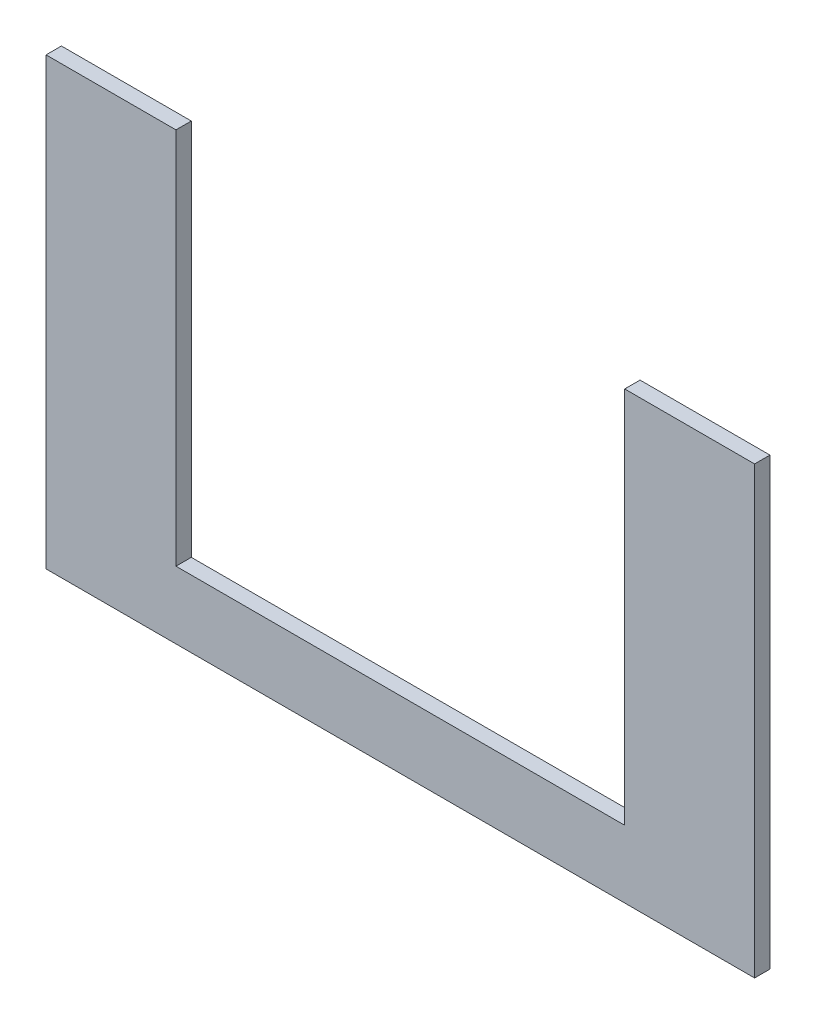
ISO-10303-21;
HEADER;
FILE_DESCRIPTION(('STEP AP214'),'2;1');
FILE_NAME('part.step','',(''),(''),'','','');
FILE_SCHEMA(('AUTOMOTIVE_DESIGN { 1 0 10303 214 1 1 1 1 }'));
ENDSEC;
DATA;
#1=APPLICATION_CONTEXT('core data for automotive mechanical design processes');
#2=APPLICATION_PROTOCOL_DEFINITION('international standard','automotive_design',2000,#1);
#3=PRODUCT_CONTEXT('',#1,'mechanical');
#4=PRODUCT('Part','Part','',(#3));
#5=PRODUCT_RELATED_PRODUCT_CATEGORY('part','',(#4));
#6=PRODUCT_DEFINITION_FORMATION('','',#4);
#7=PRODUCT_DEFINITION_CONTEXT('part definition',#1,'design');
#8=PRODUCT_DEFINITION('design','',#6,#7);
#9=PRODUCT_DEFINITION_SHAPE('','',#8);
#10=(LENGTH_UNIT() NAMED_UNIT(*) SI_UNIT(.MILLI.,.METRE.));
#11=(NAMED_UNIT(*) PLANE_ANGLE_UNIT() SI_UNIT($,.RADIAN.));
#12=(NAMED_UNIT(*) SI_UNIT($,.STERADIAN.) SOLID_ANGLE_UNIT());
#13=UNCERTAINTY_MEASURE_WITH_UNIT(LENGTH_MEASURE(1.E-05),#10,'distance_accuracy_value','');
#14=(GEOMETRIC_REPRESENTATION_CONTEXT(3) GLOBAL_UNCERTAINTY_ASSIGNED_CONTEXT((#13)) GLOBAL_UNIT_ASSIGNED_CONTEXT((#10,
#11,#12)) REPRESENTATION_CONTEXT('',''));
#15=CARTESIAN_POINT('',(0.,0.,0.));
#16=DIRECTION('',(0.,0.,1.));
#17=DIRECTION('',(1.,0.,0.));
#18=AXIS2_PLACEMENT_3D('',#15,#16,#17);
#19=CARTESIAN_POINT('',(0.,0.,0.));
#20=DIRECTION('',(0.,0.,1.));
#21=DIRECTION('',(1.,0.,0.));
#22=AXIS2_PLACEMENT_3D('',#19,#20,#21);
#23=PLANE('',#22);
#24=DIRECTION('',(1.,0.,0.));
#25=VECTOR('',#24,1.);
#26=CARTESIAN_POINT('',(-17.,0.5,0.));
#27=LINE('',#26,#25);
#28=CARTESIAN_POINT('',(-11.5384615384615,0.5,0.));
#29=VERTEX_POINT('',#28);
#30=CARTESIAN_POINT('',(11.5384615384616,0.5,0.));
#31=VERTEX_POINT('',#30);
#32=EDGE_CURVE('E11',#29,#31,#27,.T.);
#33=ORIENTED_EDGE('',*,*,#32,.F.);
#34=DIRECTION('',(0.,-1.,0.));
#35=VECTOR('',#34,1.);
#36=CARTESIAN_POINT('',(-11.5384615384615,15.,0.));
#37=LINE('',#36,#35);
#38=CARTESIAN_POINT('',(-11.5384615384615,15.,0.));
#39=VERTEX_POINT('',#38);
#40=EDGE_CURVE('E101',#39,#29,#37,.T.);
#41=ORIENTED_EDGE('',*,*,#40,.F.);
#42=DIRECTION('',(-1.,0.,0.));
#43=VECTOR('',#42,1.);
#44=CARTESIAN_POINT('',(-7.30769230769229,15.,0.));
#45=LINE('',#44,#43);
#46=CARTESIAN_POINT('',(-7.30769230769229,15.,0.));
#47=VERTEX_POINT('',#46);
#48=EDGE_CURVE('E143',#47,#39,#45,.T.);
#49=ORIENTED_EDGE('',*,*,#48,.F.);
#50=DIRECTION('',(0.,1.,0.));
#51=VECTOR('',#50,1.);
#52=CARTESIAN_POINT('',(-7.30769230769229,2.69230769230769,0.));
#53=LINE('',#52,#51);
#54=CARTESIAN_POINT('',(-7.30769230769229,2.69230769230769,0.));
#55=VERTEX_POINT('',#54);
#56=EDGE_CURVE('E141',#55,#47,#53,.T.);
#57=ORIENTED_EDGE('',*,*,#56,.F.);
#58=DIRECTION('',(-1.,0.,0.));
#59=VECTOR('',#58,1.);
#60=CARTESIAN_POINT('',(7.30769230769232,2.69230769230769,0.));
#61=LINE('',#60,#59);
#62=CARTESIAN_POINT('',(7.30769230769232,2.69230769230769,0.));
#63=VERTEX_POINT('',#62);
#64=EDGE_CURVE('E138',#63,#55,#61,.T.);
#65=ORIENTED_EDGE('',*,*,#64,.F.);
#66=DIRECTION('',(0.,-1.,0.));
#67=VECTOR('',#66,1.);
#68=CARTESIAN_POINT('',(7.30769230769232,15.,0.));
#69=LINE('',#68,#67);
#70=CARTESIAN_POINT('',(7.30769230769232,15.,0.));
#71=VERTEX_POINT('',#70);
#72=EDGE_CURVE('E134',#71,#63,#69,.T.);
#73=ORIENTED_EDGE('',*,*,#72,.F.);
#74=DIRECTION('',(-1.,0.,0.));
#75=VECTOR('',#74,1.);
#76=CARTESIAN_POINT('',(11.5384615384616,15.,0.));
#77=LINE('',#76,#75);
#78=CARTESIAN_POINT('',(11.5384615384616,15.,0.));
#79=VERTEX_POINT('',#78);
#80=EDGE_CURVE('E123',#79,#71,#77,.T.);
#81=ORIENTED_EDGE('',*,*,#80,.F.);
#82=DIRECTION('',(0.,1.,0.));
#83=VECTOR('',#82,1.);
#84=CARTESIAN_POINT('',(11.5384615384616,-15.,0.));
#85=LINE('',#84,#83);
#86=EDGE_CURVE('E112',#31,#79,#85,.T.);
#87=ORIENTED_EDGE('',*,*,#86,.F.);
#88=EDGE_LOOP('',(#33,#41,#49,#57,#65,#73,#81,#87));
#89=FACE_BOUND('',#88,.T.);
#90=ADVANCED_FACE('F39',(#89),#23,.F.);
#91=CARTESIAN_POINT('',(11.5384615384616,-15.,0.5));
#92=DIRECTION('',(-1.,0.,0.));
#93=DIRECTION('',(0.,0.,1.));
#94=AXIS2_PLACEMENT_3D('',#91,#92,#93);
#95=PLANE('',#94);
#96=DIRECTION('',(0.,1.,0.));
#97=VECTOR('',#96,1.);
#98=CARTESIAN_POINT('',(11.5384615384616,-15.,0.5));
#99=LINE('',#98,#97);
#100=CARTESIAN_POINT('',(11.5384615384616,0.5,0.5));
#101=VERTEX_POINT('',#100);
#102=CARTESIAN_POINT('',(11.5384615384616,15.,0.5));
#103=VERTEX_POINT('',#102);
#104=EDGE_CURVE('E119',#101,#103,#99,.T.);
#105=ORIENTED_EDGE('',*,*,#104,.F.);
#106=DIRECTION('',(0.,0.,-1.));
#107=VECTOR('',#106,1.);
#108=CARTESIAN_POINT('',(11.5384615384616,0.5,0.5));
#109=LINE('',#108,#107);
#110=EDGE_CURVE('E52',#101,#31,#109,.T.);
#111=ORIENTED_EDGE('',*,*,#110,.T.);
#112=ORIENTED_EDGE('',*,*,#86,.T.);
#113=DIRECTION('',(0.,0.,-1.));
#114=VECTOR('',#113,1.);
#115=CARTESIAN_POINT('',(11.5384615384616,15.,0.5));
#116=LINE('',#115,#114);
#117=EDGE_CURVE('E132',#103,#79,#116,.T.);
#118=ORIENTED_EDGE('',*,*,#117,.F.);
#119=EDGE_LOOP('',(#105,#111,#112,#118));
#120=FACE_BOUND('',#119,.T.);
#121=ADVANCED_FACE('F179',(#120),#95,.F.);
#122=CARTESIAN_POINT('',(-11.5384615384615,15.,0.5));
#123=DIRECTION('',(1.,0.,0.));
#124=DIRECTION('',(0.,0.,-1.));
#125=AXIS2_PLACEMENT_3D('',#122,#123,#124);
#126=PLANE('',#125);
#127=ORIENTED_EDGE('',*,*,#40,.T.);
#128=DIRECTION('',(0.,0.,1.));
#129=VECTOR('',#128,1.);
#130=CARTESIAN_POINT('',(-11.5384615384615,0.5,0.5));
#131=LINE('',#130,#129);
#132=CARTESIAN_POINT('',(-11.5384615384615,0.5,0.5));
#133=VERTEX_POINT('',#132);
#134=EDGE_CURVE('E96',#29,#133,#131,.T.);
#135=ORIENTED_EDGE('',*,*,#134,.T.);
#136=DIRECTION('',(0.,-1.,0.));
#137=VECTOR('',#136,1.);
#138=CARTESIAN_POINT('',(-11.5384615384615,15.,0.5));
#139=LINE('',#138,#137);
#140=CARTESIAN_POINT('',(-11.5384615384615,15.,0.5));
#141=VERTEX_POINT('',#140);
#142=EDGE_CURVE('E118',#141,#133,#139,.T.);
#143=ORIENTED_EDGE('',*,*,#142,.F.);
#144=DIRECTION('',(0.,0.,-1.));
#145=VECTOR('',#144,1.);
#146=CARTESIAN_POINT('',(-11.5384615384615,15.,0.5));
#147=LINE('',#146,#145);
#148=EDGE_CURVE('E104',#141,#39,#147,.T.);
#149=ORIENTED_EDGE('',*,*,#148,.T.);
#150=EDGE_LOOP('',(#127,#135,#143,#149));
#151=FACE_BOUND('',#150,.T.);
#152=ADVANCED_FACE('F111',(#151),#126,.F.);
#153=CARTESIAN_POINT('',(0.,0.,0.5));
#154=DIRECTION('',(0.,0.,1.));
#155=DIRECTION('',(1.,0.,0.));
#156=AXIS2_PLACEMENT_3D('',#153,#154,#155);
#157=PLANE('',#156);
#158=DIRECTION('',(-1.,0.,0.));
#159=VECTOR('',#158,1.);
#160=CARTESIAN_POINT('',(0.,0.5,0.5));
#161=LINE('',#160,#159);
#162=EDGE_CURVE('E50',#101,#133,#161,.T.);
#163=ORIENTED_EDGE('',*,*,#162,.F.);
#164=ORIENTED_EDGE('',*,*,#104,.T.);
#165=DIRECTION('',(-1.,0.,0.));
#166=VECTOR('',#165,1.);
#167=CARTESIAN_POINT('',(11.5384615384616,15.,0.5));
#168=LINE('',#167,#166);
#169=CARTESIAN_POINT('',(7.30769230769232,15.,0.5));
#170=VERTEX_POINT('',#169);
#171=EDGE_CURVE('E116',#103,#170,#168,.T.);
#172=ORIENTED_EDGE('',*,*,#171,.T.);
#173=DIRECTION('',(0.,-1.,0.));
#174=VECTOR('',#173,1.);
#175=CARTESIAN_POINT('',(7.30769230769232,15.,0.5));
#176=LINE('',#175,#174);
#177=CARTESIAN_POINT('',(7.30769230769232,2.69230769230769,0.5));
#178=VERTEX_POINT('',#177);
#179=EDGE_CURVE('E128',#170,#178,#176,.T.);
#180=ORIENTED_EDGE('',*,*,#179,.T.);
#181=DIRECTION('',(-1.,0.,0.));
#182=VECTOR('',#181,1.);
#183=CARTESIAN_POINT('',(7.30769230769232,2.69230769230769,0.5));
#184=LINE('',#183,#182);
#185=CARTESIAN_POINT('',(-7.30769230769229,2.69230769230769,0.5));
#186=VERTEX_POINT('',#185);
#187=EDGE_CURVE('E126',#178,#186,#184,.T.);
#188=ORIENTED_EDGE('',*,*,#187,.T.);
#189=DIRECTION('',(0.,1.,0.));
#190=VECTOR('',#189,1.);
#191=CARTESIAN_POINT('',(-7.30769230769229,2.69230769230769,0.5));
#192=LINE('',#191,#190);
#193=CARTESIAN_POINT('',(-7.30769230769229,15.,0.5));
#194=VERTEX_POINT('',#193);
#195=EDGE_CURVE('E127',#186,#194,#192,.T.);
#196=ORIENTED_EDGE('',*,*,#195,.T.);
#197=DIRECTION('',(-1.,0.,0.));
#198=VECTOR('',#197,1.);
#199=CARTESIAN_POINT('',(-7.30769230769229,15.,0.5));
#200=LINE('',#199,#198);
#201=EDGE_CURVE('E122',#194,#141,#200,.T.);
#202=ORIENTED_EDGE('',*,*,#201,.T.);
#203=ORIENTED_EDGE('',*,*,#142,.T.);
#204=EDGE_LOOP('',(#163,#164,#172,#180,#188,#196,#202,#203));
#205=FACE_BOUND('',#204,.T.);
#206=ADVANCED_FACE('F178',(#205),#157,.T.);
#207=CARTESIAN_POINT('',(11.5384615384616,15.,0.5));
#208=DIRECTION('',(0.,-1.,0.));
#209=DIRECTION('',(0.,0.,-1.));
#210=AXIS2_PLACEMENT_3D('',#207,#208,#209);
#211=PLANE('',#210);
#212=ORIENTED_EDGE('',*,*,#80,.T.);
#213=DIRECTION('',(0.,0.,-1.));
#214=VECTOR('',#213,1.);
#215=CARTESIAN_POINT('',(7.30769230769232,15.,0.5));
#216=LINE('',#215,#214);
#217=EDGE_CURVE('E140',#170,#71,#216,.T.);
#218=ORIENTED_EDGE('',*,*,#217,.F.);
#219=ORIENTED_EDGE('',*,*,#171,.F.);
#220=ORIENTED_EDGE('',*,*,#117,.T.);
#221=EDGE_LOOP('',(#212,#218,#219,#220));
#222=FACE_BOUND('',#221,.T.);
#223=ADVANCED_FACE('F162',(#222),#211,.F.);
#224=CARTESIAN_POINT('',(7.30769230769232,15.,0.5));
#225=DIRECTION('',(1.,0.,0.));
#226=DIRECTION('',(0.,0.,-1.));
#227=AXIS2_PLACEMENT_3D('',#224,#225,#226);
#228=PLANE('',#227);
#229=ORIENTED_EDGE('',*,*,#72,.T.);
#230=DIRECTION('',(0.,0.,-1.));
#231=VECTOR('',#230,1.);
#232=CARTESIAN_POINT('',(7.30769230769232,2.69230769230769,0.5));
#233=LINE('',#232,#231);
#234=EDGE_CURVE('E139',#178,#63,#233,.T.);
#235=ORIENTED_EDGE('',*,*,#234,.F.);
#236=ORIENTED_EDGE('',*,*,#179,.F.);
#237=ORIENTED_EDGE('',*,*,#217,.T.);
#238=EDGE_LOOP('',(#229,#235,#236,#237));
#239=FACE_BOUND('',#238,.T.);
#240=ADVANCED_FACE('F169',(#239),#228,.F.);
#241=CARTESIAN_POINT('',(7.30769230769232,2.69230769230769,0.5));
#242=DIRECTION('',(0.,-1.,0.));
#243=DIRECTION('',(0.,0.,-1.));
#244=AXIS2_PLACEMENT_3D('',#241,#242,#243);
#245=PLANE('',#244);
#246=ORIENTED_EDGE('',*,*,#64,.T.);
#247=DIRECTION('',(0.,0.,-1.));
#248=VECTOR('',#247,1.);
#249=CARTESIAN_POINT('',(-7.30769230769229,2.69230769230769,0.5));
#250=LINE('',#249,#248);
#251=EDGE_CURVE('E142',#186,#55,#250,.T.);
#252=ORIENTED_EDGE('',*,*,#251,.F.);
#253=ORIENTED_EDGE('',*,*,#187,.F.);
#254=ORIENTED_EDGE('',*,*,#234,.T.);
#255=EDGE_LOOP('',(#246,#252,#253,#254));
#256=FACE_BOUND('',#255,.T.);
#257=ADVANCED_FACE('F174',(#256),#245,.F.);
#258=CARTESIAN_POINT('',(-7.30769230769229,2.69230769230769,0.5));
#259=DIRECTION('',(-1.,0.,0.));
#260=DIRECTION('',(0.,0.,1.));
#261=AXIS2_PLACEMENT_3D('',#258,#259,#260);
#262=PLANE('',#261);
#263=ORIENTED_EDGE('',*,*,#56,.T.);
#264=DIRECTION('',(0.,0.,-1.));
#265=VECTOR('',#264,1.);
#266=CARTESIAN_POINT('',(-7.30769230769229,15.,0.5));
#267=LINE('',#266,#265);
#268=EDGE_CURVE('E147',#194,#47,#267,.T.);
#269=ORIENTED_EDGE('',*,*,#268,.F.);
#270=ORIENTED_EDGE('',*,*,#195,.F.);
#271=ORIENTED_EDGE('',*,*,#251,.T.);
#272=EDGE_LOOP('',(#263,#269,#270,#271));
#273=FACE_BOUND('',#272,.T.);
#274=ADVANCED_FACE('F197',(#273),#262,.F.);
#275=CARTESIAN_POINT('',(-7.30769230769229,15.,0.5));
#276=DIRECTION('',(0.,-1.,0.));
#277=DIRECTION('',(0.,0.,-1.));
#278=AXIS2_PLACEMENT_3D('',#275,#276,#277);
#279=PLANE('',#278);
#280=ORIENTED_EDGE('',*,*,#48,.T.);
#281=ORIENTED_EDGE('',*,*,#148,.F.);
#282=ORIENTED_EDGE('',*,*,#201,.F.);
#283=ORIENTED_EDGE('',*,*,#268,.T.);
#284=EDGE_LOOP('',(#280,#281,#282,#283));
#285=FACE_BOUND('',#284,.T.);
#286=ADVANCED_FACE('F194',(#285),#279,.F.);
#287=CARTESIAN_POINT('',(-17.,0.5,1.));
#288=DIRECTION('',(0.,1.,0.));
#289=DIRECTION('',(0.,0.,1.));
#290=AXIS2_PLACEMENT_3D('',#287,#288,#289);
#291=PLANE('',#290);
#292=ORIENTED_EDGE('',*,*,#162,.T.);
#293=ORIENTED_EDGE('',*,*,#134,.F.);
#294=ORIENTED_EDGE('',*,*,#32,.T.);
#295=ORIENTED_EDGE('',*,*,#110,.F.);
#296=EDGE_LOOP('',(#292,#293,#294,#295));
#297=FACE_BOUND('',#296,.T.);
#298=ADVANCED_FACE('F97',(#297),#291,.F.);
#299=CLOSED_SHELL('',(#90,#121,#152,#206,#223,#240,#257,#274,#286,#298));
#300=MANIFOLD_SOLID_BREP('B2',#299);
#301=ADVANCED_BREP_SHAPE_REPRESENTATION('',(#18,#300),#14);
#302=SHAPE_DEFINITION_REPRESENTATION(#9,#301);
ENDSEC;
END-ISO-10303-21;
